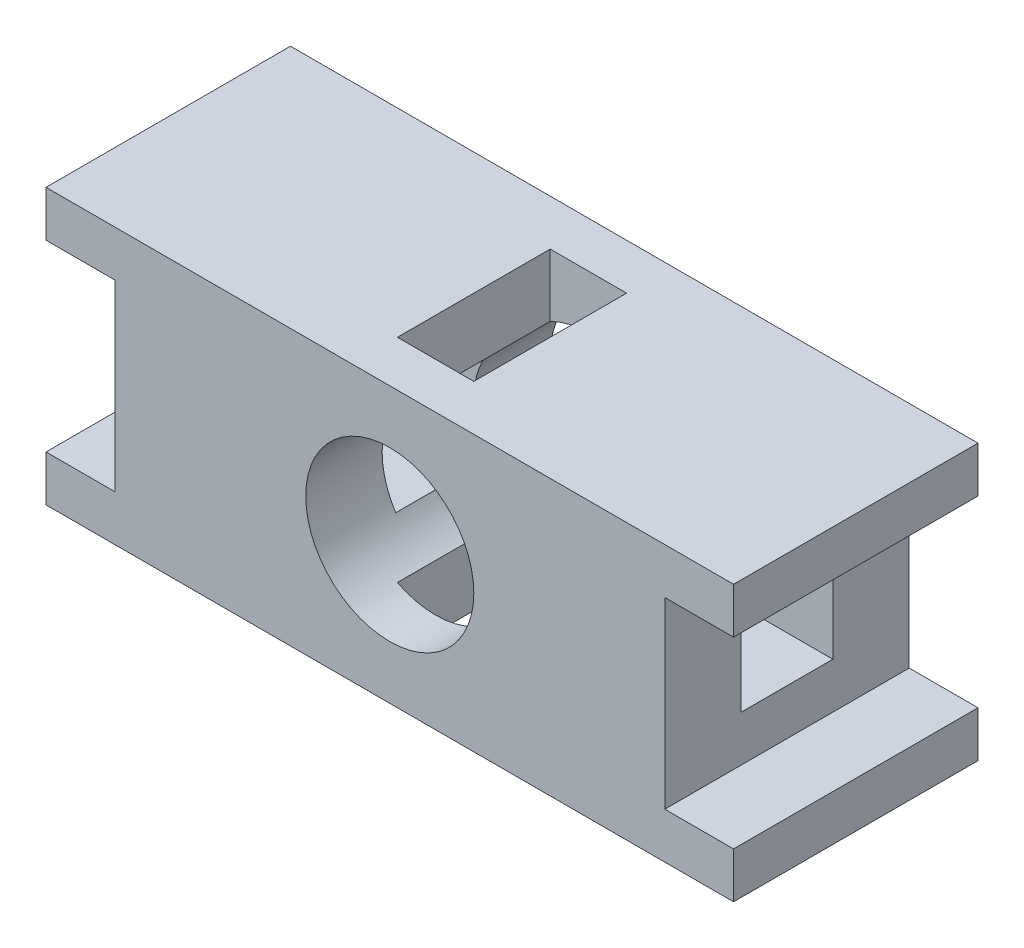
ISO-10303-21;
HEADER;
FILE_DESCRIPTION(('STEP AP214'),'2;1');
FILE_NAME('part.step','',(''),(''),'','','');
FILE_SCHEMA(('AUTOMOTIVE_DESIGN { 1 0 10303 214 1 1 1 1 }'));
ENDSEC;
DATA;
#1=APPLICATION_CONTEXT('core data for automotive mechanical design processes');
#2=APPLICATION_PROTOCOL_DEFINITION('international standard','automotive_design',2000,#1);
#3=PRODUCT_CONTEXT('',#1,'mechanical');
#4=PRODUCT('Part','Part','',(#3));
#5=PRODUCT_RELATED_PRODUCT_CATEGORY('part','',(#4));
#6=PRODUCT_DEFINITION_FORMATION('','',#4);
#7=PRODUCT_DEFINITION_CONTEXT('part definition',#1,'design');
#8=PRODUCT_DEFINITION('design','',#6,#7);
#9=PRODUCT_DEFINITION_SHAPE('','',#8);
#10=(LENGTH_UNIT() NAMED_UNIT(*) SI_UNIT(.MILLI.,.METRE.));
#11=(NAMED_UNIT(*) PLANE_ANGLE_UNIT() SI_UNIT($,.RADIAN.));
#12=(NAMED_UNIT(*) SI_UNIT($,.STERADIAN.) SOLID_ANGLE_UNIT());
#13=UNCERTAINTY_MEASURE_WITH_UNIT(LENGTH_MEASURE(1.E-05),#10,'distance_accuracy_value','');
#14=(GEOMETRIC_REPRESENTATION_CONTEXT(3) GLOBAL_UNCERTAINTY_ASSIGNED_CONTEXT((#13)) GLOBAL_UNIT_ASSIGNED_CONTEXT((#10,
#11,#12)) REPRESENTATION_CONTEXT('',''));
#15=CARTESIAN_POINT('',(0.,0.,0.));
#16=DIRECTION('',(0.,0.,1.));
#17=DIRECTION('',(1.,0.,0.));
#18=AXIS2_PLACEMENT_3D('',#15,#16,#17);
#19=CARTESIAN_POINT('',(45.,-18.,32.));
#20=DIRECTION('',(-1.,0.,0.));
#21=DIRECTION('',(0.,0.,1.));
#22=AXIS2_PLACEMENT_3D('',#19,#20,#21);
#23=PLANE('',#22);
#24=DIRECTION('',(0.,1.,0.));
#25=VECTOR('',#24,1.);
#26=CARTESIAN_POINT('',(45.,-18.,0.));
#27=LINE('',#26,#25);
#28=CARTESIAN_POINT('',(45.,-18.,0.));
#29=VERTEX_POINT('',#28);
#30=CARTESIAN_POINT('',(45.,-12.,0.));
#31=VERTEX_POINT('',#30);
#32=EDGE_CURVE('E378',#29,#31,#27,.T.);
#33=ORIENTED_EDGE('',*,*,#32,.T.);
#34=DIRECTION('',(0.,0.,1.));
#35=VECTOR('',#34,1.);
#36=CARTESIAN_POINT('',(45.,-12.,0.));
#37=LINE('',#36,#35);
#38=CARTESIAN_POINT('',(45.,-12.,32.));
#39=VERTEX_POINT('',#38);
#40=EDGE_CURVE('E330',#31,#39,#37,.T.);
#41=ORIENTED_EDGE('',*,*,#40,.T.);
#42=DIRECTION('',(0.,1.,0.));
#43=VECTOR('',#42,1.);
#44=CARTESIAN_POINT('',(45.,-18.,32.));
#45=LINE('',#44,#43);
#46=CARTESIAN_POINT('',(45.,-18.,32.));
#47=VERTEX_POINT('',#46);
#48=EDGE_CURVE('E365',#47,#39,#45,.T.);
#49=ORIENTED_EDGE('',*,*,#48,.F.);
#50=DIRECTION('',(0.,0.,-1.));
#51=VECTOR('',#50,1.);
#52=CARTESIAN_POINT('',(45.,-18.,32.));
#53=LINE('',#52,#51);
#54=EDGE_CURVE('E377',#47,#29,#53,.T.);
#55=ORIENTED_EDGE('',*,*,#54,.T.);
#56=EDGE_LOOP('',(#33,#41,#49,#55));
#57=FACE_BOUND('',#56,.T.);
#58=ADVANCED_FACE('F34',(#57),#23,.F.);
#59=CARTESIAN_POINT('',(-45.,-18.,32.));
#60=DIRECTION('',(1.,0.,0.));
#61=DIRECTION('',(0.,0.,-1.));
#62=AXIS2_PLACEMENT_3D('',#59,#60,#61);
#63=PLANE('',#62);
#64=DIRECTION('',(0.,-1.,0.));
#65=VECTOR('',#64,1.);
#66=CARTESIAN_POINT('',(-45.,-18.,0.));
#67=LINE('',#66,#65);
#68=CARTESIAN_POINT('',(-45.,18.,0.));
#69=VERTEX_POINT('',#68);
#70=CARTESIAN_POINT('',(-45.,12.,0.));
#71=VERTEX_POINT('',#70);
#72=EDGE_CURVE('E384',#69,#71,#67,.T.);
#73=ORIENTED_EDGE('',*,*,#72,.T.);
#74=DIRECTION('',(0.,0.,1.));
#75=VECTOR('',#74,1.);
#76=CARTESIAN_POINT('',(-45.,12.,0.));
#77=LINE('',#76,#75);
#78=CARTESIAN_POINT('',(-45.,12.,32.));
#79=VERTEX_POINT('',#78);
#80=EDGE_CURVE('E356',#71,#79,#77,.T.);
#81=ORIENTED_EDGE('',*,*,#80,.T.);
#82=DIRECTION('',(0.,-1.,0.));
#83=VECTOR('',#82,1.);
#84=CARTESIAN_POINT('',(-45.,-18.,32.));
#85=LINE('',#84,#83);
#86=CARTESIAN_POINT('',(-45.,18.,32.));
#87=VERTEX_POINT('',#86);
#88=EDGE_CURVE('E372',#87,#79,#85,.T.);
#89=ORIENTED_EDGE('',*,*,#88,.F.);
#90=DIRECTION('',(0.,0.,-1.));
#91=VECTOR('',#90,1.);
#92=CARTESIAN_POINT('',(-45.,18.,32.));
#93=LINE('',#92,#91);
#94=EDGE_CURVE('E394',#87,#69,#93,.T.);
#95=ORIENTED_EDGE('',*,*,#94,.T.);
#96=EDGE_LOOP('',(#73,#81,#89,#95));
#97=FACE_BOUND('',#96,.T.);
#98=ADVANCED_FACE('F451',(#97),#63,.F.);
#99=CARTESIAN_POINT('',(45.,12.,32.));
#100=VERTEX_POINT('',#99);
#101=CARTESIAN_POINT('',(45.,18.,32.));
#102=VERTEX_POINT('',#101);
#103=EDGE_CURVE('E369',#100,#102,#45,.T.);
#104=ORIENTED_EDGE('',*,*,#103,.F.);
#105=DIRECTION('',(0.,0.,1.));
#106=VECTOR('',#105,1.);
#107=CARTESIAN_POINT('',(45.,12.,0.));
#108=LINE('',#107,#106);
#109=CARTESIAN_POINT('',(45.,12.,0.));
#110=VERTEX_POINT('',#109);
#111=EDGE_CURVE('E323',#110,#100,#108,.T.);
#112=ORIENTED_EDGE('',*,*,#111,.F.);
#113=CARTESIAN_POINT('',(45.,18.,0.));
#114=VERTEX_POINT('',#113);
#115=EDGE_CURVE('E359',#110,#114,#27,.T.);
#116=ORIENTED_EDGE('',*,*,#115,.T.);
#117=DIRECTION('',(0.,0.,-1.));
#118=VECTOR('',#117,1.);
#119=CARTESIAN_POINT('',(45.,18.,32.));
#120=LINE('',#119,#118);
#121=EDGE_CURVE('E397',#102,#114,#120,.T.);
#122=ORIENTED_EDGE('',*,*,#121,.F.);
#123=EDGE_LOOP('',(#104,#112,#116,#122));
#124=FACE_BOUND('',#123,.T.);
#125=ADVANCED_FACE('F36',(#124),#23,.F.);
#126=CARTESIAN_POINT('',(-45.,18.,32.));
#127=DIRECTION('',(0.,-1.,0.));
#128=DIRECTION('',(0.,0.,-1.));
#129=AXIS2_PLACEMENT_3D('',#126,#127,#128);
#130=PLANE('',#129);
#131=DIRECTION('',(-1.,0.,0.));
#132=VECTOR('',#131,1.);
#133=CARTESIAN_POINT('',(-5.,18.,6.));
#134=LINE('',#133,#132);
#135=CARTESIAN_POINT('',(5.,18.,6.));
#136=VERTEX_POINT('',#135);
#137=CARTESIAN_POINT('',(-5.,18.,6.));
#138=VERTEX_POINT('',#137);
#139=EDGE_CURVE('E284',#136,#138,#134,.T.);
#140=ORIENTED_EDGE('',*,*,#139,.F.);
#141=DIRECTION('',(0.,0.,-1.));
#142=VECTOR('',#141,1.);
#143=CARTESIAN_POINT('',(5.,18.,6.));
#144=LINE('',#143,#142);
#145=CARTESIAN_POINT('',(5.00000000000001,18.,26.));
#146=VERTEX_POINT('',#145);
#147=EDGE_CURVE('E268',#146,#136,#144,.T.);
#148=ORIENTED_EDGE('',*,*,#147,.F.);
#149=DIRECTION('',(1.,0.,0.));
#150=VECTOR('',#149,1.);
#151=CARTESIAN_POINT('',(-4.99999999999999,18.,26.));
#152=LINE('',#151,#150);
#153=CARTESIAN_POINT('',(-4.99999999999999,18.,26.));
#154=VERTEX_POINT('',#153);
#155=EDGE_CURVE('E273',#154,#146,#152,.T.);
#156=ORIENTED_EDGE('',*,*,#155,.F.);
#157=DIRECTION('',(0.,0.,1.));
#158=VECTOR('',#157,1.);
#159=CARTESIAN_POINT('',(-5.,18.,6.));
#160=LINE('',#159,#158);
#161=EDGE_CURVE('E287',#138,#154,#160,.T.);
#162=ORIENTED_EDGE('',*,*,#161,.F.);
#163=EDGE_LOOP('',(#140,#148,#156,#162));
#164=FACE_BOUND('',#163,.T.);
#165=DIRECTION('',(-1.,0.,0.));
#166=VECTOR('',#165,1.);
#167=CARTESIAN_POINT('',(-45.,18.,0.));
#168=LINE('',#167,#166);
#169=EDGE_CURVE('E381',#114,#69,#168,.T.);
#170=ORIENTED_EDGE('',*,*,#169,.T.);
#171=ORIENTED_EDGE('',*,*,#94,.F.);
#172=DIRECTION('',(-1.,0.,0.));
#173=VECTOR('',#172,1.);
#174=CARTESIAN_POINT('',(-45.,18.,32.));
#175=LINE('',#174,#173);
#176=EDGE_CURVE('E368',#102,#87,#175,.T.);
#177=ORIENTED_EDGE('',*,*,#176,.F.);
#178=ORIENTED_EDGE('',*,*,#121,.T.);
#179=EDGE_LOOP('',(#170,#171,#177,#178));
#180=FACE_BOUND('',#179,.T.);
#181=ADVANCED_FACE('F460',(#164,#180),#130,.F.);
#182=CARTESIAN_POINT('',(-45.,-12.,32.));
#183=VERTEX_POINT('',#182);
#184=CARTESIAN_POINT('',(-45.,-18.,32.));
#185=VERTEX_POINT('',#184);
#186=EDGE_CURVE('E371',#183,#185,#85,.T.);
#187=ORIENTED_EDGE('',*,*,#186,.F.);
#188=DIRECTION('',(0.,0.,1.));
#189=VECTOR('',#188,1.);
#190=CARTESIAN_POINT('',(-45.,-12.,0.));
#191=LINE('',#190,#189);
#192=CARTESIAN_POINT('',(-45.,-12.,0.));
#193=VERTEX_POINT('',#192);
#194=EDGE_CURVE('E349',#193,#183,#191,.T.);
#195=ORIENTED_EDGE('',*,*,#194,.F.);
#196=CARTESIAN_POINT('',(-45.,-18.,0.));
#197=VERTEX_POINT('',#196);
#198=EDGE_CURVE('E383',#193,#197,#67,.T.);
#199=ORIENTED_EDGE('',*,*,#198,.T.);
#200=DIRECTION('',(0.,0.,-1.));
#201=VECTOR('',#200,1.);
#202=CARTESIAN_POINT('',(-45.,-18.,32.));
#203=LINE('',#202,#201);
#204=EDGE_CURVE('E391',#185,#197,#203,.T.);
#205=ORIENTED_EDGE('',*,*,#204,.F.);
#206=EDGE_LOOP('',(#187,#195,#199,#205));
#207=FACE_BOUND('',#206,.T.);
#208=ADVANCED_FACE('F458',(#207),#63,.F.);
#209=CARTESIAN_POINT('',(-45.,-18.,32.));
#210=DIRECTION('',(0.,1.,0.));
#211=DIRECTION('',(0.,0.,1.));
#212=AXIS2_PLACEMENT_3D('',#209,#210,#211);
#213=PLANE('',#212);
#214=DIRECTION('',(1.,0.,0.));
#215=VECTOR('',#214,1.);
#216=CARTESIAN_POINT('',(-4.99999999999999,-18.,26.));
#217=LINE('',#216,#215);
#218=CARTESIAN_POINT('',(-4.99999999999999,-18.,26.));
#219=VERTEX_POINT('',#218);
#220=CARTESIAN_POINT('',(5.00000000000001,-18.,26.));
#221=VERTEX_POINT('',#220);
#222=EDGE_CURVE('E279',#219,#221,#217,.T.);
#223=ORIENTED_EDGE('',*,*,#222,.T.);
#224=DIRECTION('',(0.,0.,-1.));
#225=VECTOR('',#224,1.);
#226=CARTESIAN_POINT('',(5.,-18.,6.));
#227=LINE('',#226,#225);
#228=CARTESIAN_POINT('',(5.,-18.,6.));
#229=VERTEX_POINT('',#228);
#230=EDGE_CURVE('E269',#221,#229,#227,.T.);
#231=ORIENTED_EDGE('',*,*,#230,.T.);
#232=DIRECTION('',(-1.,0.,0.));
#233=VECTOR('',#232,1.);
#234=CARTESIAN_POINT('',(-5.,-18.,6.));
#235=LINE('',#234,#233);
#236=CARTESIAN_POINT('',(-5.,-18.,6.));
#237=VERTEX_POINT('',#236);
#238=EDGE_CURVE('E272',#229,#237,#235,.T.);
#239=ORIENTED_EDGE('',*,*,#238,.T.);
#240=DIRECTION('',(0.,0.,1.));
#241=VECTOR('',#240,1.);
#242=CARTESIAN_POINT('',(-5.,-18.,6.));
#243=LINE('',#242,#241);
#244=EDGE_CURVE('E276',#237,#219,#243,.T.);
#245=ORIENTED_EDGE('',*,*,#244,.T.);
#246=EDGE_LOOP('',(#223,#231,#239,#245));
#247=FACE_BOUND('',#246,.T.);
#248=DIRECTION('',(1.,0.,0.));
#249=VECTOR('',#248,1.);
#250=CARTESIAN_POINT('',(-45.,-18.,0.));
#251=LINE('',#250,#249);
#252=EDGE_CURVE('E387',#197,#29,#251,.T.);
#253=ORIENTED_EDGE('',*,*,#252,.T.);
#254=ORIENTED_EDGE('',*,*,#54,.F.);
#255=DIRECTION('',(1.,0.,0.));
#256=VECTOR('',#255,1.);
#257=CARTESIAN_POINT('',(-45.,-18.,32.));
#258=LINE('',#257,#256);
#259=EDGE_CURVE('E375',#185,#47,#258,.T.);
#260=ORIENTED_EDGE('',*,*,#259,.F.);
#261=ORIENTED_EDGE('',*,*,#204,.T.);
#262=EDGE_LOOP('',(#253,#254,#260,#261));
#263=FACE_BOUND('',#262,.T.);
#264=ADVANCED_FACE('F498',(#247,#263),#213,.F.);
#265=CARTESIAN_POINT('',(0.,0.,32.));
#266=DIRECTION('',(0.,0.,-1.));
#267=DIRECTION('',(-1.,0.,0.));
#268=AXIS2_PLACEMENT_3D('',#265,#266,#267);
#269=PLANE('',#268);
#270=CARTESIAN_POINT('',(0.,0.,32.));
#271=DIRECTION('',(0.,0.,1.));
#272=DIRECTION('',(1.,0.,0.));
#273=AXIS2_PLACEMENT_3D('',#270,#271,#272);
#274=CIRCLE('',#273,11.);
#275=CARTESIAN_POINT('',(11.,0.,32.));
#276=VERTEX_POINT('',#275);
#277=EDGE_CURVE('E295',#276,#276,#274,.T.);
#278=ORIENTED_EDGE('',*,*,#277,.F.);
#279=EDGE_LOOP('',(#278));
#280=FACE_BOUND('',#279,.T.);
#281=ORIENTED_EDGE('',*,*,#48,.T.);
#282=DIRECTION('',(1.,0.,0.));
#283=VECTOR('',#282,1.);
#284=CARTESIAN_POINT('',(36.,-12.,32.));
#285=LINE('',#284,#283);
#286=CARTESIAN_POINT('',(36.,-12.,32.));
#287=VERTEX_POINT('',#286);
#288=EDGE_CURVE('E317',#287,#39,#285,.T.);
#289=ORIENTED_EDGE('',*,*,#288,.F.);
#290=DIRECTION('',(0.,-1.,0.));
#291=VECTOR('',#290,1.);
#292=CARTESIAN_POINT('',(36.,12.,32.));
#293=LINE('',#292,#291);
#294=CARTESIAN_POINT('',(36.,12.,32.));
#295=VERTEX_POINT('',#294);
#296=EDGE_CURVE('E326',#295,#287,#293,.T.);
#297=ORIENTED_EDGE('',*,*,#296,.F.);
#298=DIRECTION('',(-1.,0.,0.));
#299=VECTOR('',#298,1.);
#300=CARTESIAN_POINT('',(36.,12.,32.));
#301=LINE('',#300,#299);
#302=EDGE_CURVE('E310',#100,#295,#301,.T.);
#303=ORIENTED_EDGE('',*,*,#302,.F.);
#304=ORIENTED_EDGE('',*,*,#103,.T.);
#305=ORIENTED_EDGE('',*,*,#176,.T.);
#306=ORIENTED_EDGE('',*,*,#88,.T.);
#307=DIRECTION('',(-1.,0.,0.));
#308=VECTOR('',#307,1.);
#309=CARTESIAN_POINT('',(-45.,12.,32.));
#310=LINE('',#309,#308);
#311=CARTESIAN_POINT('',(-36.,12.,32.));
#312=VERTEX_POINT('',#311);
#313=EDGE_CURVE('E343',#312,#79,#310,.T.);
#314=ORIENTED_EDGE('',*,*,#313,.F.);
#315=DIRECTION('',(0.,1.,0.));
#316=VECTOR('',#315,1.);
#317=CARTESIAN_POINT('',(-36.,12.,32.));
#318=LINE('',#317,#316);
#319=CARTESIAN_POINT('',(-36.,-12.,32.));
#320=VERTEX_POINT('',#319);
#321=EDGE_CURVE('E352',#320,#312,#318,.T.);
#322=ORIENTED_EDGE('',*,*,#321,.F.);
#323=DIRECTION('',(1.,0.,0.));
#324=VECTOR('',#323,1.);
#325=CARTESIAN_POINT('',(-36.,-12.,32.));
#326=LINE('',#325,#324);
#327=EDGE_CURVE('E333',#183,#320,#326,.T.);
#328=ORIENTED_EDGE('',*,*,#327,.F.);
#329=ORIENTED_EDGE('',*,*,#186,.T.);
#330=ORIENTED_EDGE('',*,*,#259,.T.);
#331=EDGE_LOOP('',(#281,#289,#297,#303,#304,#305,#306,#314,#322,#328,#329,#330));
#332=FACE_BOUND('',#331,.T.);
#333=ADVANCED_FACE('F473',(#280,#332),#269,.F.);
#334=CARTESIAN_POINT('',(0.,0.,0.));
#335=DIRECTION('',(0.,0.,-1.));
#336=DIRECTION('',(-1.,0.,0.));
#337=AXIS2_PLACEMENT_3D('',#334,#335,#336);
#338=PLANE('',#337);
#339=CARTESIAN_POINT('',(0.,0.,0.));
#340=DIRECTION('',(0.,0.,1.));
#341=DIRECTION('',(1.,0.,0.));
#342=AXIS2_PLACEMENT_3D('',#339,#340,#341);
#343=CIRCLE('',#342,11.);
#344=CARTESIAN_POINT('',(11.,0.,0.));
#345=VERTEX_POINT('',#344);
#346=EDGE_CURVE('E307',#345,#345,#343,.T.);
#347=ORIENTED_EDGE('',*,*,#346,.T.);
#348=EDGE_LOOP('',(#347));
#349=FACE_BOUND('',#348,.T.);
#350=DIRECTION('',(1.,0.,0.));
#351=VECTOR('',#350,1.);
#352=CARTESIAN_POINT('',(36.,-12.,0.));
#353=LINE('',#352,#351);
#354=CARTESIAN_POINT('',(36.,-12.,0.));
#355=VERTEX_POINT('',#354);
#356=EDGE_CURVE('E320',#355,#31,#353,.T.);
#357=ORIENTED_EDGE('',*,*,#356,.T.);
#358=ORIENTED_EDGE('',*,*,#32,.F.);
#359=ORIENTED_EDGE('',*,*,#252,.F.);
#360=ORIENTED_EDGE('',*,*,#198,.F.);
#361=DIRECTION('',(1.,0.,0.));
#362=VECTOR('',#361,1.);
#363=CARTESIAN_POINT('',(-36.,-12.,0.));
#364=LINE('',#363,#362);
#365=CARTESIAN_POINT('',(-36.,-12.,0.));
#366=VERTEX_POINT('',#365);
#367=EDGE_CURVE('E339',#193,#366,#364,.T.);
#368=ORIENTED_EDGE('',*,*,#367,.T.);
#369=DIRECTION('',(0.,1.,0.));
#370=VECTOR('',#369,1.);
#371=CARTESIAN_POINT('',(-36.,12.,0.));
#372=LINE('',#371,#370);
#373=CARTESIAN_POINT('',(-36.,12.,0.));
#374=VERTEX_POINT('',#373);
#375=EDGE_CURVE('E342',#366,#374,#372,.T.);
#376=ORIENTED_EDGE('',*,*,#375,.T.);
#377=DIRECTION('',(-1.,0.,0.));
#378=VECTOR('',#377,1.);
#379=CARTESIAN_POINT('',(-45.,12.,0.));
#380=LINE('',#379,#378);
#381=EDGE_CURVE('E346',#374,#71,#380,.T.);
#382=ORIENTED_EDGE('',*,*,#381,.T.);
#383=ORIENTED_EDGE('',*,*,#72,.F.);
#384=ORIENTED_EDGE('',*,*,#169,.F.);
#385=ORIENTED_EDGE('',*,*,#115,.F.);
#386=DIRECTION('',(-1.,0.,0.));
#387=VECTOR('',#386,1.);
#388=CARTESIAN_POINT('',(36.,12.,0.));
#389=LINE('',#388,#387);
#390=CARTESIAN_POINT('',(36.,12.,0.));
#391=VERTEX_POINT('',#390);
#392=EDGE_CURVE('E313',#110,#391,#389,.T.);
#393=ORIENTED_EDGE('',*,*,#392,.T.);
#394=DIRECTION('',(0.,-1.,0.));
#395=VECTOR('',#394,1.);
#396=CARTESIAN_POINT('',(36.,12.,0.));
#397=LINE('',#396,#395);
#398=EDGE_CURVE('E316',#391,#355,#397,.T.);
#399=ORIENTED_EDGE('',*,*,#398,.T.);
#400=EDGE_LOOP('',(#357,#358,#359,#360,#368,#376,#382,#383,#384,#385,#393,#399));
#401=FACE_BOUND('',#400,.T.);
#402=ADVANCED_FACE('F506',(#349,#401),#338,.T.);
#403=CARTESIAN_POINT('',(-45.,12.,0.));
#404=DIRECTION('',(0.,1.,0.));
#405=DIRECTION('',(0.,0.,1.));
#406=AXIS2_PLACEMENT_3D('',#403,#404,#405);
#407=PLANE('',#406);
#408=ORIENTED_EDGE('',*,*,#313,.T.);
#409=ORIENTED_EDGE('',*,*,#80,.F.);
#410=ORIENTED_EDGE('',*,*,#381,.F.);
#411=DIRECTION('',(0.,0.,1.));
#412=VECTOR('',#411,1.);
#413=CARTESIAN_POINT('',(-36.,12.,0.));
#414=LINE('',#413,#412);
#415=EDGE_CURVE('E360',#374,#312,#414,.T.);
#416=ORIENTED_EDGE('',*,*,#415,.T.);
#417=EDGE_LOOP('',(#408,#409,#410,#416));
#418=FACE_BOUND('',#417,.T.);
#419=ADVANCED_FACE('F484',(#418),#407,.F.);
#420=CARTESIAN_POINT('',(-36.,12.,0.));
#421=DIRECTION('',(1.,0.,0.));
#422=DIRECTION('',(0.,0.,-1.));
#423=AXIS2_PLACEMENT_3D('',#420,#421,#422);
#424=PLANE('',#423);
#425=DIRECTION('',(0.,0.,-1.));
#426=VECTOR('',#425,1.);
#427=CARTESIAN_POINT('',(-36.,6.,10.));
#428=LINE('',#427,#426);
#429=CARTESIAN_POINT('',(-36.,6.,22.));
#430=VERTEX_POINT('',#429);
#431=CARTESIAN_POINT('',(-36.,6.,10.));
#432=VERTEX_POINT('',#431);
#433=EDGE_CURVE('E236',#430,#432,#428,.T.);
#434=ORIENTED_EDGE('',*,*,#433,.F.);
#435=DIRECTION('',(0.,1.,0.));
#436=VECTOR('',#435,1.);
#437=CARTESIAN_POINT('',(-36.,6.,22.));
#438=LINE('',#437,#436);
#439=CARTESIAN_POINT('',(-36.,-6.,22.));
#440=VERTEX_POINT('',#439);
#441=EDGE_CURVE('E51',#440,#430,#438,.T.);
#442=ORIENTED_EDGE('',*,*,#441,.F.);
#443=DIRECTION('',(0.,0.,1.));
#444=VECTOR('',#443,1.);
#445=CARTESIAN_POINT('',(-36.,-6.,10.));
#446=LINE('',#445,#444);
#447=CARTESIAN_POINT('',(-36.,-6.,10.));
#448=VERTEX_POINT('',#447);
#449=EDGE_CURVE('E244',#448,#440,#446,.T.);
#450=ORIENTED_EDGE('',*,*,#449,.F.);
#451=DIRECTION('',(0.,-1.,0.));
#452=VECTOR('',#451,1.);
#453=CARTESIAN_POINT('',(-36.,6.,10.));
#454=LINE('',#453,#452);
#455=EDGE_CURVE('E227',#432,#448,#454,.T.);
#456=ORIENTED_EDGE('',*,*,#455,.F.);
#457=EDGE_LOOP('',(#434,#442,#450,#456));
#458=FACE_BOUND('',#457,.T.);
#459=ORIENTED_EDGE('',*,*,#321,.T.);
#460=ORIENTED_EDGE('',*,*,#415,.F.);
#461=ORIENTED_EDGE('',*,*,#375,.F.);
#462=DIRECTION('',(0.,0.,1.));
#463=VECTOR('',#462,1.);
#464=CARTESIAN_POINT('',(-36.,-12.,0.));
#465=LINE('',#464,#463);
#466=EDGE_CURVE('E362',#366,#320,#465,.T.);
#467=ORIENTED_EDGE('',*,*,#466,.T.);
#468=EDGE_LOOP('',(#459,#460,#461,#467));
#469=FACE_BOUND('',#468,.T.);
#470=ADVANCED_FACE('F241',(#458,#469),#424,.F.);
#471=CARTESIAN_POINT('',(-36.,-12.,0.));
#472=DIRECTION('',(0.,-1.,0.));
#473=DIRECTION('',(1.,0.,0.));
#474=AXIS2_PLACEMENT_3D('',#471,#472,#473);
#475=PLANE('',#474);
#476=ORIENTED_EDGE('',*,*,#327,.T.);
#477=ORIENTED_EDGE('',*,*,#466,.F.);
#478=ORIENTED_EDGE('',*,*,#367,.F.);
#479=ORIENTED_EDGE('',*,*,#194,.T.);
#480=EDGE_LOOP('',(#476,#477,#478,#479));
#481=FACE_BOUND('',#480,.T.);
#482=ADVANCED_FACE('F488',(#481),#475,.F.);
#483=CARTESIAN_POINT('',(36.,-12.,0.));
#484=DIRECTION('',(0.,-1.,0.));
#485=DIRECTION('',(0.,0.,-1.));
#486=AXIS2_PLACEMENT_3D('',#483,#484,#485);
#487=PLANE('',#486);
#488=ORIENTED_EDGE('',*,*,#288,.T.);
#489=ORIENTED_EDGE('',*,*,#40,.F.);
#490=ORIENTED_EDGE('',*,*,#356,.F.);
#491=DIRECTION('',(0.,0.,1.));
#492=VECTOR('',#491,1.);
#493=CARTESIAN_POINT('',(36.,-12.,0.));
#494=LINE('',#493,#492);
#495=EDGE_CURVE('E334',#355,#287,#494,.T.);
#496=ORIENTED_EDGE('',*,*,#495,.T.);
#497=EDGE_LOOP('',(#488,#489,#490,#496));
#498=FACE_BOUND('',#497,.T.);
#499=ADVANCED_FACE('F504',(#498),#487,.F.);
#500=CARTESIAN_POINT('',(36.,12.,0.));
#501=DIRECTION('',(-1.,0.,0.));
#502=DIRECTION('',(0.,0.,1.));
#503=AXIS2_PLACEMENT_3D('',#500,#501,#502);
#504=PLANE('',#503);
#505=DIRECTION('',(0.,0.,1.));
#506=VECTOR('',#505,1.);
#507=CARTESIAN_POINT('',(36.,-6.,0.));
#508=LINE('',#507,#506);
#509=CARTESIAN_POINT('',(36.,-6.,10.));
#510=VERTEX_POINT('',#509);
#511=CARTESIAN_POINT('',(36.,-6.,22.));
#512=VERTEX_POINT('',#511);
#513=EDGE_CURVE('E262',#510,#512,#508,.T.);
#514=ORIENTED_EDGE('',*,*,#513,.T.);
#515=DIRECTION('',(0.,1.,0.));
#516=VECTOR('',#515,1.);
#517=CARTESIAN_POINT('',(36.,12.,22.));
#518=LINE('',#517,#516);
#519=CARTESIAN_POINT('',(36.,6.,22.));
#520=VERTEX_POINT('',#519);
#521=EDGE_CURVE('E265',#512,#520,#518,.T.);
#522=ORIENTED_EDGE('',*,*,#521,.T.);
#523=DIRECTION('',(0.,0.,-1.));
#524=VECTOR('',#523,1.);
#525=CARTESIAN_POINT('',(36.,6.,0.));
#526=LINE('',#525,#524);
#527=CARTESIAN_POINT('',(36.,6.,10.));
#528=VERTEX_POINT('',#527);
#529=EDGE_CURVE('E256',#520,#528,#526,.T.);
#530=ORIENTED_EDGE('',*,*,#529,.T.);
#531=DIRECTION('',(0.,-1.,0.));
#532=VECTOR('',#531,1.);
#533=CARTESIAN_POINT('',(36.,12.,10.));
#534=LINE('',#533,#532);
#535=EDGE_CURVE('E259',#528,#510,#534,.T.);
#536=ORIENTED_EDGE('',*,*,#535,.T.);
#537=EDGE_LOOP('',(#514,#522,#530,#536));
#538=FACE_BOUND('',#537,.T.);
#539=ORIENTED_EDGE('',*,*,#296,.T.);
#540=ORIENTED_EDGE('',*,*,#495,.F.);
#541=ORIENTED_EDGE('',*,*,#398,.F.);
#542=DIRECTION('',(0.,0.,1.));
#543=VECTOR('',#542,1.);
#544=CARTESIAN_POINT('',(36.,12.,0.));
#545=LINE('',#544,#543);
#546=EDGE_CURVE('E336',#391,#295,#545,.T.);
#547=ORIENTED_EDGE('',*,*,#546,.T.);
#548=EDGE_LOOP('',(#539,#540,#541,#547));
#549=FACE_BOUND('',#548,.T.);
#550=ADVANCED_FACE('F509',(#538,#549),#504,.F.);
#551=CARTESIAN_POINT('',(36.,12.,0.));
#552=DIRECTION('',(0.,1.,0.));
#553=DIRECTION('',(-1.,0.,0.));
#554=AXIS2_PLACEMENT_3D('',#551,#552,#553);
#555=PLANE('',#554);
#556=ORIENTED_EDGE('',*,*,#302,.T.);
#557=ORIENTED_EDGE('',*,*,#546,.F.);
#558=ORIENTED_EDGE('',*,*,#392,.F.);
#559=ORIENTED_EDGE('',*,*,#111,.T.);
#560=EDGE_LOOP('',(#556,#557,#558,#559));
#561=FACE_BOUND('',#560,.T.);
#562=ADVANCED_FACE('F511',(#561),#555,.F.);
#563=CARTESIAN_POINT('',(0.,0.,0.));
#564=DIRECTION('',(0.,0.,1.));
#565=DIRECTION('',(1.,0.,0.));
#566=AXIS2_PLACEMENT_3D('',#563,#564,#565);
#567=CYLINDRICAL_SURFACE('',#566,11.);
#568=DIRECTION('',(0.,0.,1.));
#569=VECTOR('',#568,1.);
#570=CARTESIAN_POINT('',(-9.21954445729289,-6.,0.));
#571=LINE('',#570,#569);
#572=CARTESIAN_POINT('',(-9.21954445729289,-6.,10.));
#573=VERTEX_POINT('',#572);
#574=CARTESIAN_POINT('',(-9.21954445729289,-6.,22.));
#575=VERTEX_POINT('',#574);
#576=EDGE_CURVE('E38',#573,#575,#571,.T.);
#577=ORIENTED_EDGE('',*,*,#576,.T.);
#578=CARTESIAN_POINT('',(0.,0.,22.));
#579=DIRECTION('',(0.,0.,1.));
#580=DIRECTION('',(1.,0.,0.));
#581=AXIS2_PLACEMENT_3D('',#578,#579,#580);
#582=CIRCLE('',#581,11.);
#583=CARTESIAN_POINT('',(-9.21954445729289,6.,22.));
#584=VERTEX_POINT('',#583);
#585=EDGE_CURVE('E11',#575,#584,#582,.F.);
#586=ORIENTED_EDGE('',*,*,#585,.T.);
#587=DIRECTION('',(0.,0.,1.));
#588=VECTOR('',#587,1.);
#589=CARTESIAN_POINT('',(-9.21954445729289,6.,0.));
#590=LINE('',#589,#588);
#591=CARTESIAN_POINT('',(-9.21954445729289,6.,10.));
#592=VERTEX_POINT('',#591);
#593=EDGE_CURVE('E429',#584,#592,#590,.F.);
#594=ORIENTED_EDGE('',*,*,#593,.T.);
#595=CARTESIAN_POINT('',(0.,0.,10.));
#596=DIRECTION('',(0.,0.,-1.));
#597=DIRECTION('',(0.,1.,0.));
#598=AXIS2_PLACEMENT_3D('',#595,#596,#597);
#599=CIRCLE('',#598,11.);
#600=EDGE_CURVE('E230',#592,#573,#599,.F.);
#601=ORIENTED_EDGE('',*,*,#600,.T.);
#602=EDGE_LOOP('',(#577,#586,#594,#601));
#603=FACE_BOUND('',#602,.T.);
#604=DIRECTION('',(0.,0.,1.));
#605=VECTOR('',#604,1.);
#606=CARTESIAN_POINT('',(9.21954445729289,6.,0.));
#607=LINE('',#606,#605);
#608=CARTESIAN_POINT('',(9.21954445729289,6.,10.));
#609=VERTEX_POINT('',#608);
#610=CARTESIAN_POINT('',(9.21954445729289,6.,22.));
#611=VERTEX_POINT('',#610);
#612=EDGE_CURVE('E420',#609,#611,#607,.T.);
#613=ORIENTED_EDGE('',*,*,#612,.T.);
#614=CARTESIAN_POINT('',(9.21954445729289,-6.,22.));
#615=VERTEX_POINT('',#614);
#616=EDGE_CURVE('E44',#611,#615,#582,.F.);
#617=ORIENTED_EDGE('',*,*,#616,.T.);
#618=DIRECTION('',(0.,0.,1.));
#619=VECTOR('',#618,1.);
#620=CARTESIAN_POINT('',(9.21954445729289,-6.,0.));
#621=LINE('',#620,#619);
#622=CARTESIAN_POINT('',(9.21954445729289,-6.,10.));
#623=VERTEX_POINT('',#622);
#624=EDGE_CURVE('E426',#615,#623,#621,.F.);
#625=ORIENTED_EDGE('',*,*,#624,.T.);
#626=EDGE_CURVE('E423',#623,#609,#599,.F.);
#627=ORIENTED_EDGE('',*,*,#626,.T.);
#628=EDGE_LOOP('',(#613,#617,#625,#627));
#629=FACE_BOUND('',#628,.T.);
#630=CARTESIAN_POINT('',(0.,0.,6.));
#631=DIRECTION('',(0.,0.,-1.));
#632=DIRECTION('',(-1.,0.,0.));
#633=AXIS2_PLACEMENT_3D('',#630,#631,#632);
#634=CIRCLE('',#633,11.);
#635=CARTESIAN_POINT('',(-5.,-9.79795897113271,6.));
#636=VERTEX_POINT('',#635);
#637=CARTESIAN_POINT('',(5.,-9.79795897113271,6.));
#638=VERTEX_POINT('',#637);
#639=EDGE_CURVE('E404',#636,#638,#634,.F.);
#640=ORIENTED_EDGE('',*,*,#639,.T.);
#641=DIRECTION('',(0.,0.,1.));
#642=VECTOR('',#641,1.);
#643=CARTESIAN_POINT('',(5.,-9.79795897113271,0.));
#644=LINE('',#643,#642);
#645=CARTESIAN_POINT('',(5.00000000000001,-9.79795897113271,26.));
#646=VERTEX_POINT('',#645);
#647=EDGE_CURVE('E417',#638,#646,#644,.T.);
#648=ORIENTED_EDGE('',*,*,#647,.T.);
#649=CARTESIAN_POINT('',(0.,0.,26.));
#650=DIRECTION('',(0.,0.,1.));
#651=DIRECTION('',(1.,0.,0.));
#652=AXIS2_PLACEMENT_3D('',#649,#650,#651);
#653=CIRCLE('',#652,11.);
#654=CARTESIAN_POINT('',(-4.99999999999999,-9.79795897113271,26.));
#655=VERTEX_POINT('',#654);
#656=EDGE_CURVE('E411',#646,#655,#653,.F.);
#657=ORIENTED_EDGE('',*,*,#656,.T.);
#658=DIRECTION('',(0.,0.,1.));
#659=VECTOR('',#658,1.);
#660=CARTESIAN_POINT('',(-5.,-9.79795897113271,0.));
#661=LINE('',#660,#659);
#662=EDGE_CURVE('E414',#655,#636,#661,.F.);
#663=ORIENTED_EDGE('',*,*,#662,.T.);
#664=EDGE_LOOP('',(#640,#648,#657,#663));
#665=FACE_BOUND('',#664,.T.);
#666=CARTESIAN_POINT('',(-4.99999999999999,9.79795897113271,26.));
#667=VERTEX_POINT('',#666);
#668=CARTESIAN_POINT('',(5.00000000000001,9.79795897113271,26.));
#669=VERTEX_POINT('',#668);
#670=EDGE_CURVE('E407',#667,#669,#653,.F.);
#671=ORIENTED_EDGE('',*,*,#670,.T.);
#672=DIRECTION('',(0.,0.,1.));
#673=VECTOR('',#672,1.);
#674=CARTESIAN_POINT('',(5.,9.79795897113271,0.));
#675=LINE('',#674,#673);
#676=CARTESIAN_POINT('',(5.,9.79795897113271,6.));
#677=VERTEX_POINT('',#676);
#678=EDGE_CURVE('E410',#669,#677,#675,.F.);
#679=ORIENTED_EDGE('',*,*,#678,.T.);
#680=CARTESIAN_POINT('',(-5.,9.79795897113271,6.));
#681=VERTEX_POINT('',#680);
#682=EDGE_CURVE('E400',#677,#681,#634,.F.);
#683=ORIENTED_EDGE('',*,*,#682,.T.);
#684=DIRECTION('',(0.,0.,1.));
#685=VECTOR('',#684,1.);
#686=CARTESIAN_POINT('',(-5.,9.79795897113271,0.));
#687=LINE('',#686,#685);
#688=EDGE_CURVE('E403',#681,#667,#687,.T.);
#689=ORIENTED_EDGE('',*,*,#688,.T.);
#690=EDGE_LOOP('',(#671,#679,#683,#689));
#691=FACE_BOUND('',#690,.T.);
#692=ORIENTED_EDGE('',*,*,#346,.F.);
#693=EDGE_LOOP('',(#692));
#694=FACE_BOUND('',#693,.T.);
#695=ORIENTED_EDGE('',*,*,#277,.T.);
#696=EDGE_LOOP('',(#695));
#697=FACE_BOUND('',#696,.T.);
#698=ADVANCED_FACE('F432',(#603,#629,#665,#691,#694,#697),#567,.F.);
#699=CARTESIAN_POINT('',(-5.,-18.,6.));
#700=DIRECTION('',(0.,0.,-1.));
#701=DIRECTION('',(-1.,0.,0.));
#702=AXIS2_PLACEMENT_3D('',#699,#700,#701);
#703=PLANE('',#702);
#704=DIRECTION('',(0.,1.,0.));
#705=VECTOR('',#704,1.);
#706=CARTESIAN_POINT('',(5.,-18.,6.));
#707=LINE('',#706,#705);
#708=EDGE_CURVE('E282',#677,#136,#707,.T.);
#709=ORIENTED_EDGE('',*,*,#708,.T.);
#710=ORIENTED_EDGE('',*,*,#139,.T.);
#711=DIRECTION('',(0.,1.,0.));
#712=VECTOR('',#711,1.);
#713=CARTESIAN_POINT('',(-5.,-18.,6.));
#714=LINE('',#713,#712);
#715=EDGE_CURVE('E304',#681,#138,#714,.T.);
#716=ORIENTED_EDGE('',*,*,#715,.F.);
#717=ORIENTED_EDGE('',*,*,#682,.F.);
#718=EDGE_LOOP('',(#709,#710,#716,#717));
#719=FACE_BOUND('',#718,.T.);
#720=ADVANCED_FACE('F518',(#719),#703,.F.);
#721=CARTESIAN_POINT('',(-5.,-18.,6.));
#722=DIRECTION('',(-1.,0.,0.));
#723=DIRECTION('',(0.,0.,1.));
#724=AXIS2_PLACEMENT_3D('',#721,#722,#723);
#725=PLANE('',#724);
#726=ORIENTED_EDGE('',*,*,#715,.T.);
#727=ORIENTED_EDGE('',*,*,#161,.T.);
#728=DIRECTION('',(0.,1.,0.));
#729=VECTOR('',#728,1.);
#730=CARTESIAN_POINT('',(-4.99999999999999,-18.,26.));
#731=LINE('',#730,#729);
#732=EDGE_CURVE('E300',#667,#154,#731,.T.);
#733=ORIENTED_EDGE('',*,*,#732,.F.);
#734=ORIENTED_EDGE('',*,*,#688,.F.);
#735=EDGE_LOOP('',(#726,#727,#733,#734));
#736=FACE_BOUND('',#735,.T.);
#737=ADVANCED_FACE('F670',(#736),#725,.F.);
#738=CARTESIAN_POINT('',(-4.99999999999999,-18.,26.));
#739=DIRECTION('',(0.,0.,1.));
#740=DIRECTION('',(1.,0.,0.));
#741=AXIS2_PLACEMENT_3D('',#738,#739,#740);
#742=PLANE('',#741);
#743=ORIENTED_EDGE('',*,*,#732,.T.);
#744=ORIENTED_EDGE('',*,*,#155,.T.);
#745=DIRECTION('',(0.,1.,0.));
#746=VECTOR('',#745,1.);
#747=CARTESIAN_POINT('',(5.00000000000001,-18.,26.));
#748=LINE('',#747,#746);
#749=EDGE_CURVE('E296',#669,#146,#748,.T.);
#750=ORIENTED_EDGE('',*,*,#749,.F.);
#751=ORIENTED_EDGE('',*,*,#670,.F.);
#752=EDGE_LOOP('',(#743,#744,#750,#751));
#753=FACE_BOUND('',#752,.T.);
#754=ADVANCED_FACE('F668',(#753),#742,.F.);
#755=CARTESIAN_POINT('',(5.,-18.,6.));
#756=DIRECTION('',(1.,0.,0.));
#757=DIRECTION('',(0.,0.,-1.));
#758=AXIS2_PLACEMENT_3D('',#755,#756,#757);
#759=PLANE('',#758);
#760=ORIENTED_EDGE('',*,*,#749,.T.);
#761=ORIENTED_EDGE('',*,*,#147,.T.);
#762=ORIENTED_EDGE('',*,*,#708,.F.);
#763=ORIENTED_EDGE('',*,*,#678,.F.);
#764=EDGE_LOOP('',(#760,#761,#762,#763));
#765=FACE_BOUND('',#764,.T.);
#766=ADVANCED_FACE('F678',(#765),#759,.F.);
#767=EDGE_CURVE('E305',#229,#638,#707,.T.);
#768=ORIENTED_EDGE('',*,*,#767,.F.);
#769=ORIENTED_EDGE('',*,*,#230,.F.);
#770=EDGE_CURVE('E292',#221,#646,#748,.T.);
#771=ORIENTED_EDGE('',*,*,#770,.T.);
#772=ORIENTED_EDGE('',*,*,#647,.F.);
#773=EDGE_LOOP('',(#768,#769,#771,#772));
#774=FACE_BOUND('',#773,.T.);
#775=ADVANCED_FACE('F696',(#774),#759,.F.);
#776=ORIENTED_EDGE('',*,*,#770,.F.);
#777=ORIENTED_EDGE('',*,*,#222,.F.);
#778=EDGE_CURVE('E297',#219,#655,#731,.T.);
#779=ORIENTED_EDGE('',*,*,#778,.T.);
#780=ORIENTED_EDGE('',*,*,#656,.F.);
#781=EDGE_LOOP('',(#776,#777,#779,#780));
#782=FACE_BOUND('',#781,.T.);
#783=ADVANCED_FACE('F689',(#782),#742,.F.);
#784=ORIENTED_EDGE('',*,*,#778,.F.);
#785=ORIENTED_EDGE('',*,*,#244,.F.);
#786=EDGE_CURVE('E301',#237,#636,#714,.T.);
#787=ORIENTED_EDGE('',*,*,#786,.T.);
#788=ORIENTED_EDGE('',*,*,#662,.F.);
#789=EDGE_LOOP('',(#784,#785,#787,#788));
#790=FACE_BOUND('',#789,.T.);
#791=ADVANCED_FACE('F684',(#790),#725,.F.);
#792=ORIENTED_EDGE('',*,*,#786,.F.);
#793=ORIENTED_EDGE('',*,*,#238,.F.);
#794=ORIENTED_EDGE('',*,*,#767,.T.);
#795=ORIENTED_EDGE('',*,*,#639,.F.);
#796=EDGE_LOOP('',(#792,#793,#794,#795));
#797=FACE_BOUND('',#796,.T.);
#798=ADVANCED_FACE('F599',(#797),#703,.F.);
#799=CARTESIAN_POINT('',(45.,6.,10.));
#800=DIRECTION('',(0.,1.,0.));
#801=DIRECTION('',(0.,0.,1.));
#802=AXIS2_PLACEMENT_3D('',#799,#800,#801);
#803=PLANE('',#802);
#804=DIRECTION('',(-1.,0.,0.));
#805=VECTOR('',#804,1.);
#806=CARTESIAN_POINT('',(45.,6.,22.));
#807=LINE('',#806,#805);
#808=EDGE_CURVE('E233',#520,#611,#807,.T.);
#809=ORIENTED_EDGE('',*,*,#808,.T.);
#810=ORIENTED_EDGE('',*,*,#612,.F.);
#811=DIRECTION('',(-1.,0.,0.));
#812=VECTOR('',#811,1.);
#813=CARTESIAN_POINT('',(45.,6.,10.));
#814=LINE('',#813,#812);
#815=EDGE_CURVE('E59',#528,#609,#814,.T.);
#816=ORIENTED_EDGE('',*,*,#815,.F.);
#817=ORIENTED_EDGE('',*,*,#529,.F.);
#818=EDGE_LOOP('',(#809,#810,#816,#817));
#819=FACE_BOUND('',#818,.T.);
#820=ADVANCED_FACE('F593',(#819),#803,.F.);
#821=CARTESIAN_POINT('',(45.,6.,10.));
#822=DIRECTION('',(0.,0.,-1.));
#823=DIRECTION('',(0.,1.,0.));
#824=AXIS2_PLACEMENT_3D('',#821,#822,#823);
#825=PLANE('',#824);
#826=ORIENTED_EDGE('',*,*,#815,.T.);
#827=ORIENTED_EDGE('',*,*,#626,.F.);
#828=DIRECTION('',(-1.,0.,0.));
#829=VECTOR('',#828,1.);
#830=CARTESIAN_POINT('',(45.,-6.,10.));
#831=LINE('',#830,#829);
#832=EDGE_CURVE('E252',#510,#623,#831,.T.);
#833=ORIENTED_EDGE('',*,*,#832,.F.);
#834=ORIENTED_EDGE('',*,*,#535,.F.);
#835=EDGE_LOOP('',(#826,#827,#833,#834));
#836=FACE_BOUND('',#835,.T.);
#837=ADVANCED_FACE('F598',(#836),#825,.F.);
#838=CARTESIAN_POINT('',(45.,-6.,10.));
#839=DIRECTION('',(0.,-1.,0.));
#840=DIRECTION('',(0.,0.,-1.));
#841=AXIS2_PLACEMENT_3D('',#838,#839,#840);
#842=PLANE('',#841);
#843=ORIENTED_EDGE('',*,*,#832,.T.);
#844=ORIENTED_EDGE('',*,*,#624,.F.);
#845=DIRECTION('',(-1.,0.,0.));
#846=VECTOR('',#845,1.);
#847=CARTESIAN_POINT('',(45.,-6.,22.));
#848=LINE('',#847,#846);
#849=EDGE_CURVE('E251',#512,#615,#848,.T.);
#850=ORIENTED_EDGE('',*,*,#849,.F.);
#851=ORIENTED_EDGE('',*,*,#513,.F.);
#852=EDGE_LOOP('',(#843,#844,#850,#851));
#853=FACE_BOUND('',#852,.T.);
#854=ADVANCED_FACE('F446',(#853),#842,.F.);
#855=CARTESIAN_POINT('',(45.,6.,22.));
#856=DIRECTION('',(0.,0.,1.));
#857=DIRECTION('',(1.,0.,0.));
#858=AXIS2_PLACEMENT_3D('',#855,#856,#857);
#859=PLANE('',#858);
#860=ORIENTED_EDGE('',*,*,#849,.T.);
#861=ORIENTED_EDGE('',*,*,#616,.F.);
#862=ORIENTED_EDGE('',*,*,#808,.F.);
#863=ORIENTED_EDGE('',*,*,#521,.F.);
#864=EDGE_LOOP('',(#860,#861,#862,#863));
#865=FACE_BOUND('',#864,.T.);
#866=ADVANCED_FACE('F439',(#865),#859,.F.);
#867=EDGE_CURVE('E249',#575,#440,#848,.T.);
#868=ORIENTED_EDGE('',*,*,#867,.T.);
#869=ORIENTED_EDGE('',*,*,#441,.T.);
#870=EDGE_CURVE('E238',#584,#430,#807,.T.);
#871=ORIENTED_EDGE('',*,*,#870,.F.);
#872=ORIENTED_EDGE('',*,*,#585,.F.);
#873=EDGE_LOOP('',(#868,#869,#871,#872));
#874=FACE_BOUND('',#873,.T.);
#875=ADVANCED_FACE('F437',(#874),#859,.F.);
#876=EDGE_CURVE('E253',#573,#448,#831,.T.);
#877=ORIENTED_EDGE('',*,*,#876,.T.);
#878=ORIENTED_EDGE('',*,*,#449,.T.);
#879=ORIENTED_EDGE('',*,*,#867,.F.);
#880=ORIENTED_EDGE('',*,*,#576,.F.);
#881=EDGE_LOOP('',(#877,#878,#879,#880));
#882=FACE_BOUND('',#881,.T.);
#883=ADVANCED_FACE('F436',(#882),#842,.F.);
#884=EDGE_CURVE('E222',#592,#432,#814,.T.);
#885=ORIENTED_EDGE('',*,*,#884,.T.);
#886=ORIENTED_EDGE('',*,*,#455,.T.);
#887=ORIENTED_EDGE('',*,*,#876,.F.);
#888=ORIENTED_EDGE('',*,*,#600,.F.);
#889=EDGE_LOOP('',(#885,#886,#887,#888));
#890=FACE_BOUND('',#889,.T.);
#891=ADVANCED_FACE('F224',(#890),#825,.F.);
#892=ORIENTED_EDGE('',*,*,#870,.T.);
#893=ORIENTED_EDGE('',*,*,#433,.T.);
#894=ORIENTED_EDGE('',*,*,#884,.F.);
#895=ORIENTED_EDGE('',*,*,#593,.F.);
#896=EDGE_LOOP('',(#892,#893,#894,#895));
#897=FACE_BOUND('',#896,.T.);
#898=ADVANCED_FACE('F237',(#897),#803,.F.);
#899=CLOSED_SHELL('',(#58,#98,#125,#181,#208,#264,#333,#402,#419,#470,#482,#499,#550,#562,#698,
#720,#737,#754,#766,#775,#783,#791,#798,#820,#837,#854,#866,#875,#883,#891,#898));
#900=MANIFOLD_SOLID_BREP('B2',#899);
#901=ADVANCED_BREP_SHAPE_REPRESENTATION('',(#18,#900),#14);
#902=SHAPE_DEFINITION_REPRESENTATION(#9,#901);
ENDSEC;
END-ISO-10303-21;
